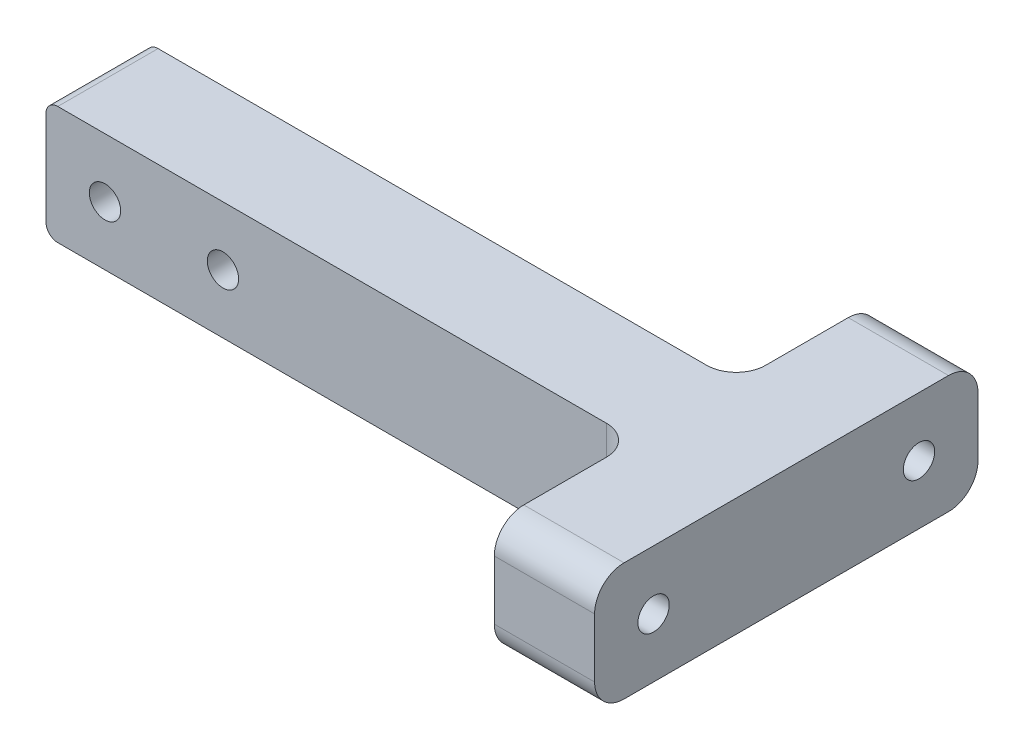
ISO-10303-21;
HEADER;
FILE_DESCRIPTION(('STEP AP214'),'2;1');
FILE_NAME('part.step','',(''),(''),'','','');
FILE_SCHEMA(('AUTOMOTIVE_DESIGN { 1 0 10303 214 1 1 1 1 }'));
ENDSEC;
DATA;
#1=APPLICATION_CONTEXT('core data for automotive mechanical design processes');
#2=APPLICATION_PROTOCOL_DEFINITION('international standard','automotive_design',2000,#1);
#3=PRODUCT_CONTEXT('',#1,'mechanical');
#4=PRODUCT('Part','Part','',(#3));
#5=PRODUCT_RELATED_PRODUCT_CATEGORY('part','',(#4));
#6=PRODUCT_DEFINITION_FORMATION('','',#4);
#7=PRODUCT_DEFINITION_CONTEXT('part definition',#1,'design');
#8=PRODUCT_DEFINITION('design','',#6,#7);
#9=PRODUCT_DEFINITION_SHAPE('','',#8);
#10=(LENGTH_UNIT() NAMED_UNIT(*) SI_UNIT(.MILLI.,.METRE.));
#11=(NAMED_UNIT(*) PLANE_ANGLE_UNIT() SI_UNIT($,.RADIAN.));
#12=(NAMED_UNIT(*) SI_UNIT($,.STERADIAN.) SOLID_ANGLE_UNIT());
#13=UNCERTAINTY_MEASURE_WITH_UNIT(LENGTH_MEASURE(1.E-05),#10,'distance_accuracy_value','');
#14=(GEOMETRIC_REPRESENTATION_CONTEXT(3) GLOBAL_UNCERTAINTY_ASSIGNED_CONTEXT((#13)) GLOBAL_UNIT_ASSIGNED_CONTEXT((#10,
#11,#12)) REPRESENTATION_CONTEXT('',''));
#15=CARTESIAN_POINT('',(0.,0.,0.));
#16=DIRECTION('',(0.,0.,1.));
#17=DIRECTION('',(1.,0.,0.));
#18=AXIS2_PLACEMENT_3D('',#15,#16,#17);
#19=CARTESIAN_POINT('',(127.,25.4,-10.795));
#20=DIRECTION('',(0.,0.,1.));
#21=DIRECTION('',(1.,0.,0.));
#22=AXIS2_PLACEMENT_3D('',#19,#20,#21);
#23=PLANE('',#22);
#24=CARTESIAN_POINT('',(38.1,12.7,-10.795));
#25=DIRECTION('',(0.,0.,1.));
#26=DIRECTION('',(1.,0.,0.));
#27=AXIS2_PLACEMENT_3D('',#24,#25,#26);
#28=CIRCLE('',#27,3.3734375);
#29=CARTESIAN_POINT('',(41.4734375,12.7,-10.795));
#30=VERTEX_POINT('',#29);
#31=EDGE_CURVE('E300',#30,#30,#28,.T.);
#32=ORIENTED_EDGE('',*,*,#31,.T.);
#33=EDGE_LOOP('',(#32));
#34=FACE_BOUND('',#33,.T.);
#35=CARTESIAN_POINT('',(12.7,12.7,-10.795));
#36=DIRECTION('',(0.,0.,1.));
#37=DIRECTION('',(1.,0.,0.));
#38=AXIS2_PLACEMENT_3D('',#35,#36,#37);
#39=CIRCLE('',#38,3.3734375);
#40=CARTESIAN_POINT('',(16.0734375,12.7,-10.795));
#41=VERTEX_POINT('',#40);
#42=EDGE_CURVE('E294',#41,#41,#39,.T.);
#43=ORIENTED_EDGE('',*,*,#42,.T.);
#44=EDGE_LOOP('',(#43));
#45=FACE_BOUND('',#44,.T.);
#46=DIRECTION('',(-1.,0.,0.));
#47=VECTOR('',#46,1.);
#48=CARTESIAN_POINT('',(127.,0.,-10.795));
#49=LINE('',#48,#47);
#50=CARTESIAN_POINT('',(120.65,0.,-10.795));
#51=VERTEX_POINT('',#50);
#52=CARTESIAN_POINT('',(2.54,0.,-10.795));
#53=VERTEX_POINT('',#52);
#54=EDGE_CURVE('E184',#51,#53,#49,.T.);
#55=ORIENTED_EDGE('',*,*,#54,.T.);
#56=CARTESIAN_POINT('',(2.54,2.54,-10.795));
#57=DIRECTION('',(0.,0.,1.));
#58=DIRECTION('',(1.,0.,0.));
#59=AXIS2_PLACEMENT_3D('',#56,#57,#58);
#60=CIRCLE('',#59,2.54);
#61=CARTESIAN_POINT('',(0.,2.54,-10.795));
#62=VERTEX_POINT('',#61);
#63=EDGE_CURVE('E42',#53,#62,#60,.F.);
#64=ORIENTED_EDGE('',*,*,#63,.T.);
#65=DIRECTION('',(0.,-1.,0.));
#66=VECTOR('',#65,1.);
#67=CARTESIAN_POINT('',(0.,25.4,-10.795));
#68=LINE('',#67,#66);
#69=CARTESIAN_POINT('',(0.,22.86,-10.795));
#70=VERTEX_POINT('',#69);
#71=EDGE_CURVE('E172',#70,#62,#68,.T.);
#72=ORIENTED_EDGE('',*,*,#71,.F.);
#73=CARTESIAN_POINT('',(2.54,22.86,-10.795));
#74=DIRECTION('',(0.,0.,1.));
#75=DIRECTION('',(1.,0.,0.));
#76=AXIS2_PLACEMENT_3D('',#73,#74,#75);
#77=CIRCLE('',#76,2.54);
#78=CARTESIAN_POINT('',(2.54,25.4,-10.795));
#79=VERTEX_POINT('',#78);
#80=EDGE_CURVE('E49',#70,#79,#77,.F.);
#81=ORIENTED_EDGE('',*,*,#80,.T.);
#82=DIRECTION('',(-1.,0.,0.));
#83=VECTOR('',#82,1.);
#84=CARTESIAN_POINT('',(127.,25.4,-10.795));
#85=LINE('',#84,#83);
#86=CARTESIAN_POINT('',(120.65,25.4,-10.795));
#87=VERTEX_POINT('',#86);
#88=EDGE_CURVE('E189',#87,#79,#85,.T.);
#89=ORIENTED_EDGE('',*,*,#88,.F.);
#90=DIRECTION('',(0.,-1.,0.));
#91=VECTOR('',#90,1.);
#92=CARTESIAN_POINT('',(120.65,0.,-10.795));
#93=LINE('',#92,#91);
#94=EDGE_CURVE('E209',#87,#51,#93,.T.);
#95=ORIENTED_EDGE('',*,*,#94,.T.);
#96=EDGE_LOOP('',(#55,#64,#72,#81,#89,#95));
#97=FACE_BOUND('',#96,.T.);
#98=ADVANCED_FACE('F34',(#34,#45,#97),#23,.F.);
#99=CARTESIAN_POINT('',(0.,25.4,-10.795));
#100=DIRECTION('',(1.,0.,0.));
#101=DIRECTION('',(0.,0.,-1.));
#102=AXIS2_PLACEMENT_3D('',#99,#100,#101);
#103=PLANE('',#102);
#104=ORIENTED_EDGE('',*,*,#71,.T.);
#105=DIRECTION('',(0.,0.,1.));
#106=VECTOR('',#105,1.);
#107=CARTESIAN_POINT('',(0.,2.54,-10.795));
#108=LINE('',#107,#106);
#109=CARTESIAN_POINT('',(0.,2.54,10.795));
#110=VERTEX_POINT('',#109);
#111=EDGE_CURVE('E262',#62,#110,#108,.T.);
#112=ORIENTED_EDGE('',*,*,#111,.T.);
#113=DIRECTION('',(0.,-1.,0.));
#114=VECTOR('',#113,1.);
#115=CARTESIAN_POINT('',(0.,25.4,10.795));
#116=LINE('',#115,#114);
#117=CARTESIAN_POINT('',(0.,22.86,10.795));
#118=VERTEX_POINT('',#117);
#119=EDGE_CURVE('E203',#118,#110,#116,.T.);
#120=ORIENTED_EDGE('',*,*,#119,.F.);
#121=DIRECTION('',(0.,0.,1.));
#122=VECTOR('',#121,1.);
#123=CARTESIAN_POINT('',(0.,22.86,-10.795));
#124=LINE('',#123,#122);
#125=EDGE_CURVE('E260',#118,#70,#124,.F.);
#126=ORIENTED_EDGE('',*,*,#125,.T.);
#127=EDGE_LOOP('',(#104,#112,#120,#126));
#128=FACE_BOUND('',#127,.T.);
#129=ADVANCED_FACE('F274',(#128),#103,.F.);
#130=CARTESIAN_POINT('',(0.,25.4,10.795));
#131=DIRECTION('',(0.,0.,-1.));
#132=DIRECTION('',(-1.,0.,0.));
#133=AXIS2_PLACEMENT_3D('',#130,#131,#132);
#134=PLANE('',#133);
#135=CARTESIAN_POINT('',(38.1,12.7,10.795));
#136=DIRECTION('',(0.,0.,1.));
#137=DIRECTION('',(1.,0.,0.));
#138=AXIS2_PLACEMENT_3D('',#135,#136,#137);
#139=CIRCLE('',#138,3.3734375);
#140=CARTESIAN_POINT('',(41.4734375,12.7,10.795));
#141=VERTEX_POINT('',#140);
#142=EDGE_CURVE('E305',#141,#141,#139,.T.);
#143=ORIENTED_EDGE('',*,*,#142,.F.);
#144=EDGE_LOOP('',(#143));
#145=FACE_BOUND('',#144,.T.);
#146=CARTESIAN_POINT('',(12.7,12.7,10.795));
#147=DIRECTION('',(0.,0.,1.));
#148=DIRECTION('',(1.,0.,0.));
#149=AXIS2_PLACEMENT_3D('',#146,#147,#148);
#150=CIRCLE('',#149,3.3734375);
#151=CARTESIAN_POINT('',(16.0734375,12.7,10.795));
#152=VERTEX_POINT('',#151);
#153=EDGE_CURVE('E296',#152,#152,#150,.T.);
#154=ORIENTED_EDGE('',*,*,#153,.F.);
#155=EDGE_LOOP('',(#154));
#156=FACE_BOUND('',#155,.T.);
#157=ORIENTED_EDGE('',*,*,#119,.T.);
#158=CARTESIAN_POINT('',(2.54,2.54,10.795));
#159=DIRECTION('',(0.,0.,-1.));
#160=DIRECTION('',(-1.,0.,0.));
#161=AXIS2_PLACEMENT_3D('',#158,#159,#160);
#162=CIRCLE('',#161,2.54);
#163=CARTESIAN_POINT('',(2.54,0.,10.795));
#164=VERTEX_POINT('',#163);
#165=EDGE_CURVE('E267',#110,#164,#162,.F.);
#166=ORIENTED_EDGE('',*,*,#165,.T.);
#167=DIRECTION('',(1.,0.,0.));
#168=VECTOR('',#167,1.);
#169=CARTESIAN_POINT('',(0.,0.,10.795));
#170=LINE('',#169,#168);
#171=CARTESIAN_POINT('',(120.65,0.,10.795));
#172=VERTEX_POINT('',#171);
#173=EDGE_CURVE('E179',#164,#172,#170,.T.);
#174=ORIENTED_EDGE('',*,*,#173,.T.);
#175=DIRECTION('',(0.,-1.,0.));
#176=VECTOR('',#175,1.);
#177=CARTESIAN_POINT('',(120.65,25.4,10.795));
#178=LINE('',#177,#176);
#179=CARTESIAN_POINT('',(120.65,25.4,10.795));
#180=VERTEX_POINT('',#179);
#181=EDGE_CURVE('E158',#172,#180,#178,.F.);
#182=ORIENTED_EDGE('',*,*,#181,.T.);
#183=DIRECTION('',(1.,0.,0.));
#184=VECTOR('',#183,1.);
#185=CARTESIAN_POINT('',(0.,25.4,10.795));
#186=LINE('',#185,#184);
#187=CARTESIAN_POINT('',(2.54,25.4,10.795));
#188=VERTEX_POINT('',#187);
#189=EDGE_CURVE('E285',#188,#180,#186,.T.);
#190=ORIENTED_EDGE('',*,*,#189,.F.);
#191=CARTESIAN_POINT('',(2.54,22.86,10.795));
#192=DIRECTION('',(0.,0.,-1.));
#193=DIRECTION('',(-1.,0.,0.));
#194=AXIS2_PLACEMENT_3D('',#191,#192,#193);
#195=CIRCLE('',#194,2.54);
#196=EDGE_CURVE('E265',#188,#118,#195,.F.);
#197=ORIENTED_EDGE('',*,*,#196,.T.);
#198=EDGE_LOOP('',(#157,#166,#174,#182,#190,#197));
#199=FACE_BOUND('',#198,.T.);
#200=ADVANCED_FACE('F279',(#145,#156,#199),#134,.F.);
#201=CARTESIAN_POINT('',(127.,25.4,10.795));
#202=DIRECTION('',(1.,0.,0.));
#203=DIRECTION('',(0.,0.,-1.));
#204=AXIS2_PLACEMENT_3D('',#201,#202,#203);
#205=PLANE('',#204);
#206=CARTESIAN_POINT('',(127.,12.7,28.575));
#207=DIRECTION('',(1.,0.,0.));
#208=DIRECTION('',(0.,0.,-1.));
#209=AXIS2_PLACEMENT_3D('',#206,#207,#208);
#210=CIRCLE('',#209,3.3734375);
#211=CARTESIAN_POINT('',(127.,12.7,25.2015625));
#212=VERTEX_POINT('',#211);
#213=EDGE_CURVE('E308',#212,#212,#210,.T.);
#214=ORIENTED_EDGE('',*,*,#213,.T.);
#215=EDGE_LOOP('',(#214));
#216=FACE_BOUND('',#215,.T.);
#217=DIRECTION('',(0.,-1.,0.));
#218=VECTOR('',#217,1.);
#219=CARTESIAN_POINT('',(127.,25.4,41.275));
#220=LINE('',#219,#218);
#221=CARTESIAN_POINT('',(127.,19.05,41.275));
#222=VERTEX_POINT('',#221);
#223=CARTESIAN_POINT('',(127.,6.35,41.275));
#224=VERTEX_POINT('',#223);
#225=EDGE_CURVE('E200',#222,#224,#220,.T.);
#226=ORIENTED_EDGE('',*,*,#225,.F.);
#227=CARTESIAN_POINT('',(127.,19.05,34.925));
#228=DIRECTION('',(1.,0.,0.));
#229=DIRECTION('',(0.,0.,-1.));
#230=AXIS2_PLACEMENT_3D('',#227,#228,#229);
#231=CIRCLE('',#230,6.35);
#232=CARTESIAN_POINT('',(127.,25.4,34.925));
#233=VERTEX_POINT('',#232);
#234=EDGE_CURVE('E258',#222,#233,#231,.F.);
#235=ORIENTED_EDGE('',*,*,#234,.T.);
#236=DIRECTION('',(0.,0.,1.));
#237=VECTOR('',#236,1.);
#238=CARTESIAN_POINT('',(127.,25.4,10.795));
#239=LINE('',#238,#237);
#240=CARTESIAN_POINT('',(127.,25.4,17.145));
#241=VERTEX_POINT('',#240);
#242=EDGE_CURVE('E171',#241,#233,#239,.T.);
#243=ORIENTED_EDGE('',*,*,#242,.F.);
#244=DIRECTION('',(0.,-1.,0.));
#245=VECTOR('',#244,1.);
#246=CARTESIAN_POINT('',(127.,0.,17.145));
#247=LINE('',#246,#245);
#248=CARTESIAN_POINT('',(127.,0.,17.145));
#249=VERTEX_POINT('',#248);
#250=EDGE_CURVE('E156',#241,#249,#247,.T.);
#251=ORIENTED_EDGE('',*,*,#250,.T.);
#252=DIRECTION('',(0.,0.,1.));
#253=VECTOR('',#252,1.);
#254=CARTESIAN_POINT('',(127.,0.,10.795));
#255=LINE('',#254,#253);
#256=CARTESIAN_POINT('',(127.,0.,34.925));
#257=VERTEX_POINT('',#256);
#258=EDGE_CURVE('E168',#249,#257,#255,.T.);
#259=ORIENTED_EDGE('',*,*,#258,.T.);
#260=CARTESIAN_POINT('',(127.,6.35,34.925));
#261=DIRECTION('',(1.,0.,0.));
#262=DIRECTION('',(0.,0.,-1.));
#263=AXIS2_PLACEMENT_3D('',#260,#261,#262);
#264=CIRCLE('',#263,6.35);
#265=EDGE_CURVE('E256',#257,#224,#264,.F.);
#266=ORIENTED_EDGE('',*,*,#265,.T.);
#267=EDGE_LOOP('',(#226,#235,#243,#251,#259,#266));
#268=FACE_BOUND('',#267,.T.);
#269=ADVANCED_FACE('F167',(#216,#268),#205,.F.);
#270=CARTESIAN_POINT('',(127.,25.4,41.275));
#271=DIRECTION('',(0.,0.,-1.));
#272=DIRECTION('',(-1.,0.,0.));
#273=AXIS2_PLACEMENT_3D('',#270,#271,#272);
#274=PLANE('',#273);
#275=DIRECTION('',(0.,-1.,0.));
#276=VECTOR('',#275,1.);
#277=CARTESIAN_POINT('',(148.59,25.4,41.275));
#278=LINE('',#277,#276);
#279=CARTESIAN_POINT('',(148.59,19.05,41.275));
#280=VERTEX_POINT('',#279);
#281=CARTESIAN_POINT('',(148.59,6.35,41.275));
#282=VERTEX_POINT('',#281);
#283=EDGE_CURVE('E197',#280,#282,#278,.T.);
#284=ORIENTED_EDGE('',*,*,#283,.F.);
#285=DIRECTION('',(1.,0.,0.));
#286=VECTOR('',#285,1.);
#287=CARTESIAN_POINT('',(127.,19.05,41.275));
#288=LINE('',#287,#286);
#289=EDGE_CURVE('E254',#280,#222,#288,.F.);
#290=ORIENTED_EDGE('',*,*,#289,.T.);
#291=ORIENTED_EDGE('',*,*,#225,.T.);
#292=DIRECTION('',(1.,0.,0.));
#293=VECTOR('',#292,1.);
#294=CARTESIAN_POINT('',(127.,6.35,41.275));
#295=LINE('',#294,#293);
#296=EDGE_CURVE('E251',#224,#282,#295,.T.);
#297=ORIENTED_EDGE('',*,*,#296,.T.);
#298=EDGE_LOOP('',(#284,#290,#291,#297));
#299=FACE_BOUND('',#298,.T.);
#300=ADVANCED_FACE('F323',(#299),#274,.F.);
#301=CARTESIAN_POINT('',(148.59,25.4,41.275));
#302=DIRECTION('',(-1.,0.,0.));
#303=DIRECTION('',(0.,0.,1.));
#304=AXIS2_PLACEMENT_3D('',#301,#302,#303);
#305=PLANE('',#304);
#306=CARTESIAN_POINT('',(148.59,12.6999999999999,-28.575));
#307=DIRECTION('',(1.,0.,0.));
#308=DIRECTION('',(0.,0.,1.));
#309=AXIS2_PLACEMENT_3D('',#306,#307,#308);
#310=CIRCLE('',#309,3.3734375);
#311=CARTESIAN_POINT('',(148.59,12.6999999999999,-25.2015625));
#312=VERTEX_POINT('',#311);
#313=EDGE_CURVE('E225',#312,#312,#310,.T.);
#314=ORIENTED_EDGE('',*,*,#313,.F.);
#315=EDGE_LOOP('',(#314));
#316=FACE_BOUND('',#315,.T.);
#317=CARTESIAN_POINT('',(148.59,12.7,28.575));
#318=DIRECTION('',(1.,0.,0.));
#319=DIRECTION('',(0.,0.,-1.));
#320=AXIS2_PLACEMENT_3D('',#317,#318,#319);
#321=CIRCLE('',#320,3.3734375);
#322=CARTESIAN_POINT('',(148.59,12.7,25.2015625));
#323=VERTEX_POINT('',#322);
#324=EDGE_CURVE('E224',#323,#323,#321,.T.);
#325=ORIENTED_EDGE('',*,*,#324,.F.);
#326=EDGE_LOOP('',(#325));
#327=FACE_BOUND('',#326,.T.);
#328=DIRECTION('',(0.,-1.,0.));
#329=VECTOR('',#328,1.);
#330=CARTESIAN_POINT('',(148.59,25.4,-41.275));
#331=LINE('',#330,#329);
#332=CARTESIAN_POINT('',(148.59,19.05,-41.275));
#333=VERTEX_POINT('',#332);
#334=CARTESIAN_POINT('',(148.59,6.35,-41.275));
#335=VERTEX_POINT('',#334);
#336=EDGE_CURVE('E193',#333,#335,#331,.T.);
#337=ORIENTED_EDGE('',*,*,#336,.F.);
#338=CARTESIAN_POINT('',(148.59,19.05,-34.925));
#339=DIRECTION('',(-1.,0.,0.));
#340=DIRECTION('',(0.,0.,1.));
#341=AXIS2_PLACEMENT_3D('',#338,#339,#340);
#342=CIRCLE('',#341,6.35);
#343=CARTESIAN_POINT('',(148.59,25.4,-34.925));
#344=VERTEX_POINT('',#343);
#345=EDGE_CURVE('E246',#333,#344,#342,.F.);
#346=ORIENTED_EDGE('',*,*,#345,.T.);
#347=DIRECTION('',(0.,0.,-1.));
#348=VECTOR('',#347,1.);
#349=CARTESIAN_POINT('',(148.59,25.4,41.275));
#350=LINE('',#349,#348);
#351=CARTESIAN_POINT('',(148.59,25.4,34.925));
#352=VERTEX_POINT('',#351);
#353=EDGE_CURVE('E287',#352,#344,#350,.T.);
#354=ORIENTED_EDGE('',*,*,#353,.F.);
#355=CARTESIAN_POINT('',(148.59,19.05,34.925));
#356=DIRECTION('',(-1.,0.,0.));
#357=DIRECTION('',(0.,0.,1.));
#358=AXIS2_PLACEMENT_3D('',#355,#356,#357);
#359=CIRCLE('',#358,6.35);
#360=EDGE_CURVE('E242',#352,#280,#359,.F.);
#361=ORIENTED_EDGE('',*,*,#360,.T.);
#362=ORIENTED_EDGE('',*,*,#283,.T.);
#363=CARTESIAN_POINT('',(148.59,6.35,34.925));
#364=DIRECTION('',(-1.,0.,0.));
#365=DIRECTION('',(0.,0.,1.));
#366=AXIS2_PLACEMENT_3D('',#363,#364,#365);
#367=CIRCLE('',#366,6.35);
#368=CARTESIAN_POINT('',(148.59,0.,34.925));
#369=VERTEX_POINT('',#368);
#370=EDGE_CURVE('E240',#282,#369,#367,.F.);
#371=ORIENTED_EDGE('',*,*,#370,.T.);
#372=DIRECTION('',(0.,0.,-1.));
#373=VECTOR('',#372,1.);
#374=CARTESIAN_POINT('',(148.59,0.,41.275));
#375=LINE('',#374,#373);
#376=CARTESIAN_POINT('',(148.59,0.,-34.925));
#377=VERTEX_POINT('',#376);
#378=EDGE_CURVE('E178',#369,#377,#375,.T.);
#379=ORIENTED_EDGE('',*,*,#378,.T.);
#380=CARTESIAN_POINT('',(148.59,6.35,-34.925));
#381=DIRECTION('',(-1.,0.,0.));
#382=DIRECTION('',(0.,0.,1.));
#383=AXIS2_PLACEMENT_3D('',#380,#381,#382);
#384=CIRCLE('',#383,6.35);
#385=EDGE_CURVE('E244',#377,#335,#384,.F.);
#386=ORIENTED_EDGE('',*,*,#385,.T.);
#387=EDGE_LOOP('',(#337,#346,#354,#361,#362,#371,#379,#386));
#388=FACE_BOUND('',#387,.T.);
#389=ADVANCED_FACE('F319',(#316,#327,#388),#305,.F.);
#390=CARTESIAN_POINT('',(148.59,25.4,-41.275));
#391=DIRECTION('',(0.,0.,1.));
#392=DIRECTION('',(1.,0.,0.));
#393=AXIS2_PLACEMENT_3D('',#390,#391,#392);
#394=PLANE('',#393);
#395=DIRECTION('',(0.,-1.,0.));
#396=VECTOR('',#395,1.);
#397=CARTESIAN_POINT('',(127.,25.4,-41.275));
#398=LINE('',#397,#396);
#399=CARTESIAN_POINT('',(127.,19.05,-41.275));
#400=VERTEX_POINT('',#399);
#401=CARTESIAN_POINT('',(127.,6.35,-41.275));
#402=VERTEX_POINT('',#401);
#403=EDGE_CURVE('E190',#400,#402,#398,.T.);
#404=ORIENTED_EDGE('',*,*,#403,.F.);
#405=DIRECTION('',(-1.,0.,0.));
#406=VECTOR('',#405,1.);
#407=CARTESIAN_POINT('',(148.59,19.05,-41.275));
#408=LINE('',#407,#406);
#409=EDGE_CURVE('E238',#400,#333,#408,.F.);
#410=ORIENTED_EDGE('',*,*,#409,.T.);
#411=ORIENTED_EDGE('',*,*,#336,.T.);
#412=DIRECTION('',(-1.,0.,0.));
#413=VECTOR('',#412,1.);
#414=CARTESIAN_POINT('',(148.59,6.35,-41.275));
#415=LINE('',#414,#413);
#416=EDGE_CURVE('E235',#335,#402,#415,.T.);
#417=ORIENTED_EDGE('',*,*,#416,.T.);
#418=EDGE_LOOP('',(#404,#410,#411,#417));
#419=FACE_BOUND('',#418,.T.);
#420=ADVANCED_FACE('F322',(#419),#394,.F.);
#421=CARTESIAN_POINT('',(127.,25.4,-41.275));
#422=DIRECTION('',(1.,0.,0.));
#423=DIRECTION('',(0.,0.,-1.));
#424=AXIS2_PLACEMENT_3D('',#421,#422,#423);
#425=PLANE('',#424);
#426=CARTESIAN_POINT('',(127.,12.6999999999999,-28.575));
#427=DIRECTION('',(1.,0.,0.));
#428=DIRECTION('',(0.,0.,-1.));
#429=AXIS2_PLACEMENT_3D('',#426,#427,#428);
#430=CIRCLE('',#429,3.3734375);
#431=CARTESIAN_POINT('',(127.,12.6999999999999,-31.9484375));
#432=VERTEX_POINT('',#431);
#433=EDGE_CURVE('E221',#432,#432,#430,.T.);
#434=ORIENTED_EDGE('',*,*,#433,.T.);
#435=EDGE_LOOP('',(#434));
#436=FACE_BOUND('',#435,.T.);
#437=DIRECTION('',(0.,0.,1.));
#438=VECTOR('',#437,1.);
#439=CARTESIAN_POINT('',(127.,25.4,-41.275));
#440=LINE('',#439,#438);
#441=CARTESIAN_POINT('',(127.,25.4,-34.925));
#442=VERTEX_POINT('',#441);
#443=CARTESIAN_POINT('',(127.,25.4,-17.145));
#444=VERTEX_POINT('',#443);
#445=EDGE_CURVE('E194',#442,#444,#440,.T.);
#446=ORIENTED_EDGE('',*,*,#445,.F.);
#447=CARTESIAN_POINT('',(127.,19.05,-34.925));
#448=DIRECTION('',(1.,0.,0.));
#449=DIRECTION('',(0.,0.,-1.));
#450=AXIS2_PLACEMENT_3D('',#447,#448,#449);
#451=CIRCLE('',#450,6.35);
#452=EDGE_CURVE('E233',#442,#400,#451,.F.);
#453=ORIENTED_EDGE('',*,*,#452,.T.);
#454=ORIENTED_EDGE('',*,*,#403,.T.);
#455=CARTESIAN_POINT('',(127.,6.35,-34.925));
#456=DIRECTION('',(1.,0.,0.));
#457=DIRECTION('',(0.,0.,-1.));
#458=AXIS2_PLACEMENT_3D('',#455,#456,#457);
#459=CIRCLE('',#458,6.35);
#460=CARTESIAN_POINT('',(127.,0.,-34.925));
#461=VERTEX_POINT('',#460);
#462=EDGE_CURVE('E231',#402,#461,#459,.F.);
#463=ORIENTED_EDGE('',*,*,#462,.T.);
#464=DIRECTION('',(0.,0.,1.));
#465=VECTOR('',#464,1.);
#466=CARTESIAN_POINT('',(127.,0.,-41.275));
#467=LINE('',#466,#465);
#468=CARTESIAN_POINT('',(127.,0.,-17.145));
#469=VERTEX_POINT('',#468);
#470=EDGE_CURVE('E182',#461,#469,#467,.T.);
#471=ORIENTED_EDGE('',*,*,#470,.T.);
#472=DIRECTION('',(0.,-1.,0.));
#473=VECTOR('',#472,1.);
#474=CARTESIAN_POINT('',(127.,25.4,-17.145));
#475=LINE('',#474,#473);
#476=EDGE_CURVE('E161',#469,#444,#475,.F.);
#477=ORIENTED_EDGE('',*,*,#476,.T.);
#478=EDGE_LOOP('',(#446,#453,#454,#463,#471,#477));
#479=FACE_BOUND('',#478,.T.);
#480=ADVANCED_FACE('F339',(#436,#479),#425,.F.);
#481=CARTESIAN_POINT('',(0.,25.4,0.));
#482=DIRECTION('',(0.,1.,0.));
#483=DIRECTION('',(0.,0.,1.));
#484=AXIS2_PLACEMENT_3D('',#481,#482,#483);
#485=PLANE('',#484);
#486=ORIENTED_EDGE('',*,*,#88,.T.);
#487=DIRECTION('',(0.,0.,1.));
#488=VECTOR('',#487,1.);
#489=CARTESIAN_POINT('',(2.54,25.4,10.795));
#490=LINE('',#489,#488);
#491=EDGE_CURVE('E11',#79,#188,#490,.T.);
#492=ORIENTED_EDGE('',*,*,#491,.T.);
#493=ORIENTED_EDGE('',*,*,#189,.T.);
#494=CARTESIAN_POINT('',(120.65,25.4,17.145));
#495=DIRECTION('',(0.,1.,0.));
#496=DIRECTION('',(0.,0.,1.));
#497=AXIS2_PLACEMENT_3D('',#494,#495,#496);
#498=CIRCLE('',#497,6.35);
#499=EDGE_CURVE('E160',#180,#241,#498,.F.);
#500=ORIENTED_EDGE('',*,*,#499,.T.);
#501=ORIENTED_EDGE('',*,*,#242,.T.);
#502=DIRECTION('',(1.,0.,0.));
#503=VECTOR('',#502,1.);
#504=CARTESIAN_POINT('',(148.59,25.4,34.925));
#505=LINE('',#504,#503);
#506=EDGE_CURVE('E220',#233,#352,#505,.T.);
#507=ORIENTED_EDGE('',*,*,#506,.T.);
#508=ORIENTED_EDGE('',*,*,#353,.T.);
#509=DIRECTION('',(-1.,0.,0.));
#510=VECTOR('',#509,1.);
#511=CARTESIAN_POINT('',(127.,25.4,-34.925));
#512=LINE('',#511,#510);
#513=EDGE_CURVE('E228',#344,#442,#512,.T.);
#514=ORIENTED_EDGE('',*,*,#513,.T.);
#515=ORIENTED_EDGE('',*,*,#445,.T.);
#516=CARTESIAN_POINT('',(120.65,25.4,-17.145));
#517=DIRECTION('',(0.,1.,0.));
#518=DIRECTION('',(0.,0.,1.));
#519=AXIS2_PLACEMENT_3D('',#516,#517,#518);
#520=CIRCLE('',#519,6.35);
#521=EDGE_CURVE('E218',#444,#87,#520,.F.);
#522=ORIENTED_EDGE('',*,*,#521,.T.);
#523=EDGE_LOOP('',(#486,#492,#493,#500,#501,#507,#508,#514,#515,#522));
#524=FACE_BOUND('',#523,.T.);
#525=ADVANCED_FACE('F284',(#524),#485,.T.);
#526=CARTESIAN_POINT('',(0.,0.,0.));
#527=DIRECTION('',(0.,1.,0.));
#528=DIRECTION('',(0.,0.,1.));
#529=AXIS2_PLACEMENT_3D('',#526,#527,#528);
#530=PLANE('',#529);
#531=ORIENTED_EDGE('',*,*,#173,.F.);
#532=DIRECTION('',(0.,0.,1.));
#533=VECTOR('',#532,1.);
#534=CARTESIAN_POINT('',(2.54,0.,0.));
#535=LINE('',#534,#533);
#536=EDGE_CURVE('E57',#164,#53,#535,.F.);
#537=ORIENTED_EDGE('',*,*,#536,.T.);
#538=ORIENTED_EDGE('',*,*,#54,.F.);
#539=CARTESIAN_POINT('',(120.65,0.,-17.145));
#540=DIRECTION('',(0.,1.,0.));
#541=DIRECTION('',(0.,0.,1.));
#542=AXIS2_PLACEMENT_3D('',#539,#540,#541);
#543=CIRCLE('',#542,6.35);
#544=EDGE_CURVE('E215',#51,#469,#543,.T.);
#545=ORIENTED_EDGE('',*,*,#544,.T.);
#546=ORIENTED_EDGE('',*,*,#470,.F.);
#547=DIRECTION('',(-1.,0.,0.));
#548=VECTOR('',#547,1.);
#549=CARTESIAN_POINT('',(0.,0.,-34.925));
#550=LINE('',#549,#548);
#551=EDGE_CURVE('E249',#461,#377,#550,.F.);
#552=ORIENTED_EDGE('',*,*,#551,.T.);
#553=ORIENTED_EDGE('',*,*,#378,.F.);
#554=DIRECTION('',(1.,0.,0.));
#555=VECTOR('',#554,1.);
#556=CARTESIAN_POINT('',(0.,0.,34.925));
#557=LINE('',#556,#555);
#558=EDGE_CURVE('E177',#369,#257,#557,.F.);
#559=ORIENTED_EDGE('',*,*,#558,.T.);
#560=ORIENTED_EDGE('',*,*,#258,.F.);
#561=CARTESIAN_POINT('',(120.65,0.,17.145));
#562=DIRECTION('',(0.,1.,0.));
#563=DIRECTION('',(0.,0.,1.));
#564=AXIS2_PLACEMENT_3D('',#561,#562,#563);
#565=CIRCLE('',#564,6.35);
#566=EDGE_CURVE('E152',#249,#172,#565,.T.);
#567=ORIENTED_EDGE('',*,*,#566,.T.);
#568=EDGE_LOOP('',(#531,#537,#538,#545,#546,#552,#553,#559,#560,#567));
#569=FACE_BOUND('',#568,.T.);
#570=ADVANCED_FACE('F174',(#569),#530,.F.);
#571=CARTESIAN_POINT('',(120.65,25.4,17.145));
#572=DIRECTION('',(0.,1.,0.));
#573=DIRECTION('',(0.,0.,1.));
#574=AXIS2_PLACEMENT_3D('',#571,#572,#573);
#575=CYLINDRICAL_SURFACE('',#574,6.35);
#576=ORIENTED_EDGE('',*,*,#499,.F.);
#577=ORIENTED_EDGE('',*,*,#181,.F.);
#578=ORIENTED_EDGE('',*,*,#566,.F.);
#579=ORIENTED_EDGE('',*,*,#250,.F.);
#580=EDGE_LOOP('',(#576,#577,#578,#579));
#581=FACE_BOUND('',#580,.T.);
#582=ADVANCED_FACE('F155',(#581),#575,.F.);
#583=CARTESIAN_POINT('',(120.65,25.4,-17.145));
#584=DIRECTION('',(0.,1.,0.));
#585=DIRECTION('',(0.,0.,1.));
#586=AXIS2_PLACEMENT_3D('',#583,#584,#585);
#587=CYLINDRICAL_SURFACE('',#586,6.35);
#588=ORIENTED_EDGE('',*,*,#521,.F.);
#589=ORIENTED_EDGE('',*,*,#476,.F.);
#590=ORIENTED_EDGE('',*,*,#544,.F.);
#591=ORIENTED_EDGE('',*,*,#94,.F.);
#592=EDGE_LOOP('',(#588,#589,#590,#591));
#593=FACE_BOUND('',#592,.T.);
#594=ADVANCED_FACE('F346',(#593),#587,.F.);
#595=CARTESIAN_POINT('',(12.7,12.7,-41.275));
#596=DIRECTION('',(0.,0.,1.));
#597=DIRECTION('',(1.,0.,0.));
#598=AXIS2_PLACEMENT_3D('',#595,#596,#597);
#599=CYLINDRICAL_SURFACE('',#598,3.3734375);
#600=CARTESIAN_POINT('',(16.0734375,12.7,10.795));
#601=CARTESIAN_POINT('',(16.0734375,12.7,10.5701041666667));
#602=CARTESIAN_POINT('',(16.0734375,12.7,10.3452083333333));
#603=CARTESIAN_POINT('',(16.0734375,12.7,9.89541666666667));
#604=CARTESIAN_POINT('',(16.0734375,12.7,9.67052083333333));
#605=CARTESIAN_POINT('',(16.0734375,12.7,9.22072916666666));
#606=CARTESIAN_POINT('',(16.0734375,12.7,8.99583333333333));
#607=CARTESIAN_POINT('',(16.0734375,12.7,8.54604166666667));
#608=CARTESIAN_POINT('',(16.0734375,12.7,8.32114583333333));
#609=CARTESIAN_POINT('',(16.0734375,12.7,7.87135416666667));
#610=CARTESIAN_POINT('',(16.0734375,12.7,7.64645833333333));
#611=CARTESIAN_POINT('',(16.0734375,12.7,7.19666666666667));
#612=CARTESIAN_POINT('',(16.0734375,12.7,6.97177083333333));
#613=CARTESIAN_POINT('',(16.0734375,12.7,6.52197916666667));
#614=CARTESIAN_POINT('',(16.0734375,12.7,6.29708333333333));
#615=CARTESIAN_POINT('',(16.0734375,12.7,5.84729166666667));
#616=CARTESIAN_POINT('',(16.0734375,12.7,5.62239583333333));
#617=CARTESIAN_POINT('',(16.0734375,12.7,5.17260416666667));
#618=CARTESIAN_POINT('',(16.0734375,12.7,4.94770833333333));
#619=CARTESIAN_POINT('',(16.0734375,12.7,4.49791666666667));
#620=CARTESIAN_POINT('',(16.0734375,12.7,4.27302083333333));
#621=CARTESIAN_POINT('',(16.0734375,12.7,3.82322916666667));
#622=CARTESIAN_POINT('',(16.0734375,12.7,3.59833333333333));
#623=CARTESIAN_POINT('',(16.0734375,12.7,3.14854166666667));
#624=CARTESIAN_POINT('',(16.0734375,12.7,2.92364583333333));
#625=CARTESIAN_POINT('',(16.0734375,12.7,2.47385416666667));
#626=CARTESIAN_POINT('',(16.0734375,12.7,2.24895833333333));
#627=CARTESIAN_POINT('',(16.0734375,12.7,1.79916666666667));
#628=CARTESIAN_POINT('',(16.0734375,12.7,1.57427083333333));
#629=CARTESIAN_POINT('',(16.0734375,12.7,1.12447916666667));
#630=CARTESIAN_POINT('',(16.0734375,12.7,0.899583333333333));
#631=CARTESIAN_POINT('',(16.0734375,12.7,0.449791666666667));
#632=CARTESIAN_POINT('',(16.0734375,12.7,0.224895833333333));
#633=CARTESIAN_POINT('',(16.0734375,12.7,-0.224895833333333));
#634=CARTESIAN_POINT('',(16.0734375,12.7,-0.449791666666667));
#635=CARTESIAN_POINT('',(16.0734375,12.7,-0.899583333333333));
#636=CARTESIAN_POINT('',(16.0734375,12.7,-1.12447916666667));
#637=CARTESIAN_POINT('',(16.0734375,12.7,-1.57427083333333));
#638=CARTESIAN_POINT('',(16.0734375,12.7,-1.79916666666667));
#639=CARTESIAN_POINT('',(16.0734375,12.7,-2.24895833333333));
#640=CARTESIAN_POINT('',(16.0734375,12.7,-2.47385416666667));
#641=CARTESIAN_POINT('',(16.0734375,12.7,-2.92364583333333));
#642=CARTESIAN_POINT('',(16.0734375,12.7,-3.14854166666667));
#643=CARTESIAN_POINT('',(16.0734375,12.7,-3.59833333333333));
#644=CARTESIAN_POINT('',(16.0734375,12.7,-3.82322916666667));
#645=CARTESIAN_POINT('',(16.0734375,12.7,-4.27302083333333));
#646=CARTESIAN_POINT('',(16.0734375,12.7,-4.49791666666667));
#647=CARTESIAN_POINT('',(16.0734375,12.7,-4.94770833333333));
#648=CARTESIAN_POINT('',(16.0734375,12.7,-5.17260416666667));
#649=CARTESIAN_POINT('',(16.0734375,12.7,-5.62239583333333));
#650=CARTESIAN_POINT('',(16.0734375,12.7,-5.84729166666667));
#651=CARTESIAN_POINT('',(16.0734375,12.7,-6.29708333333333));
#652=CARTESIAN_POINT('',(16.0734375,12.7,-6.52197916666667));
#653=CARTESIAN_POINT('',(16.0734375,12.7,-6.97177083333333));
#654=CARTESIAN_POINT('',(16.0734375,12.7,-7.19666666666667));
#655=CARTESIAN_POINT('',(16.0734375,12.7,-7.64645833333333));
#656=CARTESIAN_POINT('',(16.0734375,12.7,-7.87135416666667));
#657=CARTESIAN_POINT('',(16.0734375,12.7,-8.32114583333333));
#658=CARTESIAN_POINT('',(16.0734375,12.7,-8.54604166666667));
#659=CARTESIAN_POINT('',(16.0734375,12.7,-8.99583333333333));
#660=CARTESIAN_POINT('',(16.0734375,12.7,-9.22072916666666));
#661=CARTESIAN_POINT('',(16.0734375,12.7,-9.67052083333333));
#662=CARTESIAN_POINT('',(16.0734375,12.7,-9.89541666666666));
#663=CARTESIAN_POINT('',(16.0734375,12.7,-10.3452083333333));
#664=CARTESIAN_POINT('',(16.0734375,12.7,-10.5701041666667));
#665=CARTESIAN_POINT('',(16.0734375,12.7,-10.795));
#666=B_SPLINE_CURVE_WITH_KNOTS('',3,(#600,#601,#602,#603,#604,#605,#606,#607,#608,#609,#610,
#611,#612,#613,#614,#615,#616,#617,#618,#619,#620,#621,#622,#623,#624,#625,#626,#627,#628,#629,
#630,#631,#632,#633,#634,#635,#636,#637,#638,#639,#640,#641,#642,#643,#644,#645,#646,#647,#648,
#649,#650,#651,#652,#653,#654,#655,#656,#657,#658,#659,#660,#661,#662,#663,#664,#665),
.UNSPECIFIED.,.F.,.F.,(4,2,2,2,2,2,2,2,2,2,2,2,2,2,2,2,2,2,2,2,2,2,2,2,2,2,2,2,2,2,2,2,4),(0.,
0.6746875,1.349375,2.0240625,2.69875,3.3734375,4.048125,4.7228125,5.3975,6.0721875,6.746875,
7.4215625,8.09625,8.7709375,9.445625,10.1203125,10.795,11.4696875,12.144375,12.8190625,13.49375,
14.1684375,14.843125,15.5178125,16.1925,16.8671875,17.541875,18.2165625,18.89125,19.5659375,
20.240625,20.9153125,21.59),.UNSPECIFIED.);
#667=EDGE_CURVE('BSEAM370',#152,#41,#666,.T.);
#668=ORIENTED_EDGE('',*,*,#153,.T.);
#669=ORIENTED_EDGE('',*,*,#42,.F.);
#670=ORIENTED_EDGE('',*,*,#667,.T.);
#671=ORIENTED_EDGE('',*,*,#667,.F.);
#672=EDGE_LOOP('',(#668,#670,#669,#671));
#673=FACE_BOUND('',#672,.T.);
#674=ADVANCED_FACE('F370',(#673),#599,.F.);
#675=CARTESIAN_POINT('',(38.1,12.7,-41.275));
#676=DIRECTION('',(0.,0.,1.));
#677=DIRECTION('',(1.,0.,0.));
#678=AXIS2_PLACEMENT_3D('',#675,#676,#677);
#679=CYLINDRICAL_SURFACE('',#678,3.3734375);
#680=CARTESIAN_POINT('',(41.4734375,12.7,10.795));
#681=CARTESIAN_POINT('',(41.4734375,12.7,10.5701041666667));
#682=CARTESIAN_POINT('',(41.4734375,12.7,10.3452083333333));
#683=CARTESIAN_POINT('',(41.4734375,12.7,9.89541666666667));
#684=CARTESIAN_POINT('',(41.4734375,12.7,9.67052083333333));
#685=CARTESIAN_POINT('',(41.4734375,12.7,9.22072916666666));
#686=CARTESIAN_POINT('',(41.4734375,12.7,8.99583333333333));
#687=CARTESIAN_POINT('',(41.4734375,12.7,8.54604166666667));
#688=CARTESIAN_POINT('',(41.4734375,12.7,8.32114583333333));
#689=CARTESIAN_POINT('',(41.4734375,12.7,7.87135416666667));
#690=CARTESIAN_POINT('',(41.4734375,12.7,7.64645833333333));
#691=CARTESIAN_POINT('',(41.4734375,12.7,7.19666666666667));
#692=CARTESIAN_POINT('',(41.4734375,12.7,6.97177083333333));
#693=CARTESIAN_POINT('',(41.4734375,12.7,6.52197916666667));
#694=CARTESIAN_POINT('',(41.4734375,12.7,6.29708333333333));
#695=CARTESIAN_POINT('',(41.4734375,12.7,5.84729166666667));
#696=CARTESIAN_POINT('',(41.4734375,12.7,5.62239583333333));
#697=CARTESIAN_POINT('',(41.4734375,12.7,5.17260416666667));
#698=CARTESIAN_POINT('',(41.4734375,12.7,4.94770833333333));
#699=CARTESIAN_POINT('',(41.4734375,12.7,4.49791666666667));
#700=CARTESIAN_POINT('',(41.4734375,12.7,4.27302083333333));
#701=CARTESIAN_POINT('',(41.4734375,12.7,3.82322916666667));
#702=CARTESIAN_POINT('',(41.4734375,12.7,3.59833333333333));
#703=CARTESIAN_POINT('',(41.4734375,12.7,3.14854166666667));
#704=CARTESIAN_POINT('',(41.4734375,12.7,2.92364583333333));
#705=CARTESIAN_POINT('',(41.4734375,12.7,2.47385416666667));
#706=CARTESIAN_POINT('',(41.4734375,12.7,2.24895833333333));
#707=CARTESIAN_POINT('',(41.4734375,12.7,1.79916666666667));
#708=CARTESIAN_POINT('',(41.4734375,12.7,1.57427083333333));
#709=CARTESIAN_POINT('',(41.4734375,12.7,1.12447916666667));
#710=CARTESIAN_POINT('',(41.4734375,12.7,0.899583333333333));
#711=CARTESIAN_POINT('',(41.4734375,12.7,0.449791666666667));
#712=CARTESIAN_POINT('',(41.4734375,12.7,0.224895833333333));
#713=CARTESIAN_POINT('',(41.4734375,12.7,-0.224895833333333));
#714=CARTESIAN_POINT('',(41.4734375,12.7,-0.449791666666667));
#715=CARTESIAN_POINT('',(41.4734375,12.7,-0.899583333333333));
#716=CARTESIAN_POINT('',(41.4734375,12.7,-1.12447916666667));
#717=CARTESIAN_POINT('',(41.4734375,12.7,-1.57427083333333));
#718=CARTESIAN_POINT('',(41.4734375,12.7,-1.79916666666667));
#719=CARTESIAN_POINT('',(41.4734375,12.7,-2.24895833333333));
#720=CARTESIAN_POINT('',(41.4734375,12.7,-2.47385416666667));
#721=CARTESIAN_POINT('',(41.4734375,12.7,-2.92364583333333));
#722=CARTESIAN_POINT('',(41.4734375,12.7,-3.14854166666667));
#723=CARTESIAN_POINT('',(41.4734375,12.7,-3.59833333333333));
#724=CARTESIAN_POINT('',(41.4734375,12.7,-3.82322916666667));
#725=CARTESIAN_POINT('',(41.4734375,12.7,-4.27302083333333));
#726=CARTESIAN_POINT('',(41.4734375,12.7,-4.49791666666667));
#727=CARTESIAN_POINT('',(41.4734375,12.7,-4.94770833333333));
#728=CARTESIAN_POINT('',(41.4734375,12.7,-5.17260416666667));
#729=CARTESIAN_POINT('',(41.4734375,12.7,-5.62239583333333));
#730=CARTESIAN_POINT('',(41.4734375,12.7,-5.84729166666667));
#731=CARTESIAN_POINT('',(41.4734375,12.7,-6.29708333333333));
#732=CARTESIAN_POINT('',(41.4734375,12.7,-6.52197916666667));
#733=CARTESIAN_POINT('',(41.4734375,12.7,-6.97177083333333));
#734=CARTESIAN_POINT('',(41.4734375,12.7,-7.19666666666667));
#735=CARTESIAN_POINT('',(41.4734375,12.7,-7.64645833333333));
#736=CARTESIAN_POINT('',(41.4734375,12.7,-7.87135416666667));
#737=CARTESIAN_POINT('',(41.4734375,12.7,-8.32114583333333));
#738=CARTESIAN_POINT('',(41.4734375,12.7,-8.54604166666667));
#739=CARTESIAN_POINT('',(41.4734375,12.7,-8.99583333333333));
#740=CARTESIAN_POINT('',(41.4734375,12.7,-9.22072916666666));
#741=CARTESIAN_POINT('',(41.4734375,12.7,-9.67052083333333));
#742=CARTESIAN_POINT('',(41.4734375,12.7,-9.89541666666666));
#743=CARTESIAN_POINT('',(41.4734375,12.7,-10.3452083333333));
#744=CARTESIAN_POINT('',(41.4734375,12.7,-10.5701041666667));
#745=CARTESIAN_POINT('',(41.4734375,12.7,-10.795));
#746=B_SPLINE_CURVE_WITH_KNOTS('',3,(#680,#681,#682,#683,#684,#685,#686,#687,#688,#689,#690,
#691,#692,#693,#694,#695,#696,#697,#698,#699,#700,#701,#702,#703,#704,#705,#706,#707,#708,#709,
#710,#711,#712,#713,#714,#715,#716,#717,#718,#719,#720,#721,#722,#723,#724,#725,#726,#727,#728,
#729,#730,#731,#732,#733,#734,#735,#736,#737,#738,#739,#740,#741,#742,#743,#744,#745),
.UNSPECIFIED.,.F.,.F.,(4,2,2,2,2,2,2,2,2,2,2,2,2,2,2,2,2,2,2,2,2,2,2,2,2,2,2,2,2,2,2,2,4),(0.,
0.6746875,1.349375,2.0240625,2.69875,3.3734375,4.048125,4.7228125,5.3975,6.0721875,6.746875,
7.4215625,8.09625,8.7709375,9.445625,10.1203125,10.795,11.4696875,12.144375,12.8190625,13.49375,
14.1684375,14.843125,15.5178125,16.1925,16.8671875,17.541875,18.2165625,18.89125,19.5659375,
20.240625,20.9153125,21.59),.UNSPECIFIED.);
#747=EDGE_CURVE('BSEAM503',#141,#30,#746,.T.);
#748=ORIENTED_EDGE('',*,*,#142,.T.);
#749=ORIENTED_EDGE('',*,*,#31,.F.);
#750=ORIENTED_EDGE('',*,*,#747,.T.);
#751=ORIENTED_EDGE('',*,*,#747,.F.);
#752=EDGE_LOOP('',(#748,#750,#749,#751));
#753=FACE_BOUND('',#752,.T.);
#754=ADVANCED_FACE('F503',(#753),#679,.F.);
#755=CARTESIAN_POINT('',(0.,12.7,28.575));
#756=DIRECTION('',(1.,0.,0.));
#757=DIRECTION('',(0.,0.,-1.));
#758=AXIS2_PLACEMENT_3D('',#755,#756,#757);
#759=CYLINDRICAL_SURFACE('',#758,3.3734375);
#760=ORIENTED_EDGE('',*,*,#324,.T.);
#761=EDGE_LOOP('',(#760));
#762=FACE_BOUND('',#761,.T.);
#763=ORIENTED_EDGE('',*,*,#213,.F.);
#764=EDGE_LOOP('',(#763));
#765=FACE_BOUND('',#764,.T.);
#766=ADVANCED_FACE('F494',(#762,#765),#759,.F.);
#767=CARTESIAN_POINT('',(0.,12.6999999999999,-28.575));
#768=DIRECTION('',(1.,0.,0.));
#769=DIRECTION('',(0.,0.,-1.));
#770=AXIS2_PLACEMENT_3D('',#767,#768,#769);
#771=CYLINDRICAL_SURFACE('',#770,3.3734375);
#772=ORIENTED_EDGE('',*,*,#313,.T.);
#773=EDGE_LOOP('',(#772));
#774=FACE_BOUND('',#773,.T.);
#775=ORIENTED_EDGE('',*,*,#433,.F.);
#776=EDGE_LOOP('',(#775));
#777=FACE_BOUND('',#776,.T.);
#778=ADVANCED_FACE('F316',(#774,#777),#771,.F.);
#779=CARTESIAN_POINT('',(0.,19.05,-34.925));
#780=DIRECTION('',(1.,0.,0.));
#781=DIRECTION('',(0.,0.,-1.));
#782=AXIS2_PLACEMENT_3D('',#779,#780,#781);
#783=CYLINDRICAL_SURFACE('',#782,6.35);
#784=ORIENTED_EDGE('',*,*,#345,.F.);
#785=ORIENTED_EDGE('',*,*,#409,.F.);
#786=ORIENTED_EDGE('',*,*,#452,.F.);
#787=ORIENTED_EDGE('',*,*,#513,.F.);
#788=EDGE_LOOP('',(#784,#785,#786,#787));
#789=FACE_BOUND('',#788,.T.);
#790=ADVANCED_FACE('F336',(#789),#783,.T.);
#791=CARTESIAN_POINT('',(148.59,6.35,-34.925));
#792=DIRECTION('',(-1.,0.,0.));
#793=DIRECTION('',(0.,0.,1.));
#794=AXIS2_PLACEMENT_3D('',#791,#792,#793);
#795=CYLINDRICAL_SURFACE('',#794,6.35);
#796=ORIENTED_EDGE('',*,*,#385,.F.);
#797=ORIENTED_EDGE('',*,*,#551,.F.);
#798=ORIENTED_EDGE('',*,*,#462,.F.);
#799=ORIENTED_EDGE('',*,*,#416,.F.);
#800=EDGE_LOOP('',(#796,#797,#798,#799));
#801=FACE_BOUND('',#800,.T.);
#802=ADVANCED_FACE('F349',(#801),#795,.T.);
#803=CARTESIAN_POINT('',(0.,19.05,34.925));
#804=DIRECTION('',(-1.,0.,0.));
#805=DIRECTION('',(0.,0.,1.));
#806=AXIS2_PLACEMENT_3D('',#803,#804,#805);
#807=CYLINDRICAL_SURFACE('',#806,6.35);
#808=ORIENTED_EDGE('',*,*,#234,.F.);
#809=ORIENTED_EDGE('',*,*,#289,.F.);
#810=ORIENTED_EDGE('',*,*,#360,.F.);
#811=ORIENTED_EDGE('',*,*,#506,.F.);
#812=EDGE_LOOP('',(#808,#809,#810,#811));
#813=FACE_BOUND('',#812,.T.);
#814=ADVANCED_FACE('F375',(#813),#807,.T.);
#815=CARTESIAN_POINT('',(127.,6.35,34.925));
#816=DIRECTION('',(1.,0.,0.));
#817=DIRECTION('',(0.,0.,-1.));
#818=AXIS2_PLACEMENT_3D('',#815,#816,#817);
#819=CYLINDRICAL_SURFACE('',#818,6.35);
#820=ORIENTED_EDGE('',*,*,#265,.F.);
#821=ORIENTED_EDGE('',*,*,#558,.F.);
#822=ORIENTED_EDGE('',*,*,#370,.F.);
#823=ORIENTED_EDGE('',*,*,#296,.F.);
#824=EDGE_LOOP('',(#820,#821,#822,#823));
#825=FACE_BOUND('',#824,.T.);
#826=ADVANCED_FACE('F378',(#825),#819,.T.);
#827=CARTESIAN_POINT('',(2.54,2.54,-10.795));
#828=DIRECTION('',(0.,0.,1.));
#829=DIRECTION('',(1.,0.,0.));
#830=AXIS2_PLACEMENT_3D('',#827,#828,#829);
#831=CYLINDRICAL_SURFACE('',#830,2.54);
#832=ORIENTED_EDGE('',*,*,#63,.F.);
#833=ORIENTED_EDGE('',*,*,#536,.F.);
#834=ORIENTED_EDGE('',*,*,#165,.F.);
#835=ORIENTED_EDGE('',*,*,#111,.F.);
#836=EDGE_LOOP('',(#832,#833,#834,#835));
#837=FACE_BOUND('',#836,.T.);
#838=ADVANCED_FACE('F277',(#837),#831,.T.);
#839=CARTESIAN_POINT('',(2.54,22.86,0.));
#840=DIRECTION('',(0.,0.,-1.));
#841=DIRECTION('',(-1.,0.,0.));
#842=AXIS2_PLACEMENT_3D('',#839,#840,#841);
#843=CYLINDRICAL_SURFACE('',#842,2.54);
#844=ORIENTED_EDGE('',*,*,#80,.F.);
#845=ORIENTED_EDGE('',*,*,#125,.F.);
#846=ORIENTED_EDGE('',*,*,#196,.F.);
#847=ORIENTED_EDGE('',*,*,#491,.F.);
#848=EDGE_LOOP('',(#844,#845,#846,#847));
#849=FACE_BOUND('',#848,.T.);
#850=ADVANCED_FACE('F36',(#849),#843,.T.);
#851=CLOSED_SHELL('',(#98,#129,#200,#269,#300,#389,#420,#480,#525,#570,#582,#594,#674,#754,#766,
#778,#790,#802,#814,#826,#838,#850));
#852=MANIFOLD_SOLID_BREP('B2',#851);
#853=ADVANCED_BREP_SHAPE_REPRESENTATION('',(#18,#852),#14);
#854=SHAPE_DEFINITION_REPRESENTATION(#9,#853);
ENDSEC;
END-ISO-10303-21;
